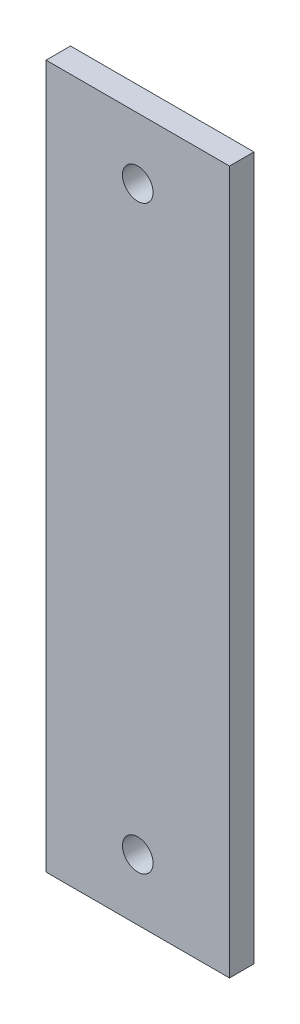
ISO-10303-21;
HEADER;
FILE_DESCRIPTION(('STEP AP214'),'2;1');
FILE_NAME('part.step','',(''),(''),'','','');
FILE_SCHEMA(('AUTOMOTIVE_DESIGN { 1 0 10303 214 1 1 1 1 }'));
ENDSEC;
DATA;
#1=APPLICATION_CONTEXT('core data for automotive mechanical design processes');
#2=APPLICATION_PROTOCOL_DEFINITION('international standard','automotive_design',2000,#1);
#3=PRODUCT_CONTEXT('',#1,'mechanical');
#4=PRODUCT('Part','Part','',(#3));
#5=PRODUCT_RELATED_PRODUCT_CATEGORY('part','',(#4));
#6=PRODUCT_DEFINITION_FORMATION('','',#4);
#7=PRODUCT_DEFINITION_CONTEXT('part definition',#1,'design');
#8=PRODUCT_DEFINITION('design','',#6,#7);
#9=PRODUCT_DEFINITION_SHAPE('','',#8);
#10=(LENGTH_UNIT() NAMED_UNIT(*) SI_UNIT(.MILLI.,.METRE.));
#11=(NAMED_UNIT(*) PLANE_ANGLE_UNIT() SI_UNIT($,.RADIAN.));
#12=(NAMED_UNIT(*) SI_UNIT($,.STERADIAN.) SOLID_ANGLE_UNIT());
#13=UNCERTAINTY_MEASURE_WITH_UNIT(LENGTH_MEASURE(1.E-05),#10,'distance_accuracy_value','');
#14=(GEOMETRIC_REPRESENTATION_CONTEXT(3) GLOBAL_UNCERTAINTY_ASSIGNED_CONTEXT((#13)) GLOBAL_UNIT_ASSIGNED_CONTEXT((#10,
#11,#12)) REPRESENTATION_CONTEXT('',''));
#15=CARTESIAN_POINT('',(0.,0.,0.));
#16=DIRECTION('',(0.,0.,1.));
#17=DIRECTION('',(1.,0.,0.));
#18=AXIS2_PLACEMENT_3D('',#15,#16,#17);
#19=CARTESIAN_POINT('',(0.,0.,4.));
#20=DIRECTION('',(0.,0.,1.));
#21=DIRECTION('',(1.,0.,0.));
#22=AXIS2_PLACEMENT_3D('',#19,#20,#21);
#23=PLANE('',#22);
#24=CARTESIAN_POINT('',(0.,47.5,4.));
#25=DIRECTION('',(0.,0.,1.));
#26=DIRECTION('',(1.,0.,0.));
#27=AXIS2_PLACEMENT_3D('',#24,#25,#26);
#28=CIRCLE('',#27,2.5);
#29=CARTESIAN_POINT('',(2.5,47.5,4.));
#30=VERTEX_POINT('',#29);
#31=EDGE_CURVE('E118',#30,#30,#28,.T.);
#32=ORIENTED_EDGE('',*,*,#31,.F.);
#33=EDGE_LOOP('',(#32));
#34=FACE_BOUND('',#33,.T.);
#35=DIRECTION('',(0.,1.,0.));
#36=VECTOR('',#35,1.);
#37=CARTESIAN_POINT('',(15.,57.5,4.));
#38=LINE('',#37,#36);
#39=CARTESIAN_POINT('',(15.,-57.5,4.));
#40=VERTEX_POINT('',#39);
#41=CARTESIAN_POINT('',(15.,57.5,4.));
#42=VERTEX_POINT('',#41);
#43=EDGE_CURVE('E98',#40,#42,#38,.T.);
#44=ORIENTED_EDGE('',*,*,#43,.T.);
#45=DIRECTION('',(-1.,0.,0.));
#46=VECTOR('',#45,1.);
#47=CARTESIAN_POINT('',(-15.,57.5,4.));
#48=LINE('',#47,#46);
#49=CARTESIAN_POINT('',(-15.,57.5,4.));
#50=VERTEX_POINT('',#49);
#51=EDGE_CURVE('E93',#42,#50,#48,.T.);
#52=ORIENTED_EDGE('',*,*,#51,.T.);
#53=DIRECTION('',(0.,-1.,0.));
#54=VECTOR('',#53,1.);
#55=CARTESIAN_POINT('',(-15.,57.5,4.));
#56=LINE('',#55,#54);
#57=CARTESIAN_POINT('',(-15.,-57.5,4.));
#58=VERTEX_POINT('',#57);
#59=EDGE_CURVE('E96',#50,#58,#56,.T.);
#60=ORIENTED_EDGE('',*,*,#59,.T.);
#61=DIRECTION('',(1.,0.,0.));
#62=VECTOR('',#61,1.);
#63=CARTESIAN_POINT('',(-15.,-57.5,4.));
#64=LINE('',#63,#62);
#65=EDGE_CURVE('E63',#58,#40,#64,.T.);
#66=ORIENTED_EDGE('',*,*,#65,.T.);
#67=EDGE_LOOP('',(#44,#52,#60,#66));
#68=FACE_BOUND('',#67,.T.);
#69=CARTESIAN_POINT('',(0.,-47.5,4.));
#70=DIRECTION('',(0.,0.,1.));
#71=DIRECTION('',(-1.,0.,0.));
#72=AXIS2_PLACEMENT_3D('',#69,#70,#71);
#73=CIRCLE('',#72,2.5);
#74=CARTESIAN_POINT('',(-2.5,-47.5,4.));
#75=VERTEX_POINT('',#74);
#76=EDGE_CURVE('E140',#75,#75,#73,.T.);
#77=ORIENTED_EDGE('',*,*,#76,.F.);
#78=EDGE_LOOP('',(#77));
#79=FACE_BOUND('',#78,.T.);
#80=ADVANCED_FACE('F45',(#34,#68,#79),#23,.T.);
#81=CARTESIAN_POINT('',(0.,0.,0.));
#82=DIRECTION('',(0.,0.,1.));
#83=DIRECTION('',(1.,0.,0.));
#84=AXIS2_PLACEMENT_3D('',#81,#82,#83);
#85=PLANE('',#84);
#86=DIRECTION('',(0.,1.,0.));
#87=VECTOR('',#86,1.);
#88=CARTESIAN_POINT('',(15.,57.5,0.));
#89=LINE('',#88,#87);
#90=CARTESIAN_POINT('',(15.,-57.5,0.));
#91=VERTEX_POINT('',#90);
#92=CARTESIAN_POINT('',(15.,57.5,0.));
#93=VERTEX_POINT('',#92);
#94=EDGE_CURVE('E114',#91,#93,#89,.T.);
#95=ORIENTED_EDGE('',*,*,#94,.F.);
#96=DIRECTION('',(1.,0.,0.));
#97=VECTOR('',#96,1.);
#98=CARTESIAN_POINT('',(-15.,-57.5,0.));
#99=LINE('',#98,#97);
#100=CARTESIAN_POINT('',(-15.,-57.5,0.));
#101=VERTEX_POINT('',#100);
#102=EDGE_CURVE('E86',#101,#91,#99,.T.);
#103=ORIENTED_EDGE('',*,*,#102,.F.);
#104=DIRECTION('',(0.,-1.,0.));
#105=VECTOR('',#104,1.);
#106=CARTESIAN_POINT('',(-15.,57.5,0.));
#107=LINE('',#106,#105);
#108=CARTESIAN_POINT('',(-15.,57.5,0.));
#109=VERTEX_POINT('',#108);
#110=EDGE_CURVE('E80',#109,#101,#107,.T.);
#111=ORIENTED_EDGE('',*,*,#110,.F.);
#112=DIRECTION('',(-1.,0.,0.));
#113=VECTOR('',#112,1.);
#114=CARTESIAN_POINT('',(-15.,57.5,0.));
#115=LINE('',#114,#113);
#116=EDGE_CURVE('E103',#93,#109,#115,.T.);
#117=ORIENTED_EDGE('',*,*,#116,.F.);
#118=EDGE_LOOP('',(#95,#103,#111,#117));
#119=FACE_BOUND('',#118,.T.);
#120=CARTESIAN_POINT('',(0.,47.5,0.));
#121=DIRECTION('',(0.,0.,1.));
#122=DIRECTION('',(1.,0.,0.));
#123=AXIS2_PLACEMENT_3D('',#120,#121,#122);
#124=CIRCLE('',#123,2.5);
#125=CARTESIAN_POINT('',(2.5,47.5,0.));
#126=VERTEX_POINT('',#125);
#127=EDGE_CURVE('E136',#126,#126,#124,.T.);
#128=ORIENTED_EDGE('',*,*,#127,.T.);
#129=EDGE_LOOP('',(#128));
#130=FACE_BOUND('',#129,.T.);
#131=CARTESIAN_POINT('',(0.,-47.5,0.));
#132=DIRECTION('',(0.,0.,1.));
#133=DIRECTION('',(-1.,0.,0.));
#134=AXIS2_PLACEMENT_3D('',#131,#132,#133);
#135=CIRCLE('',#134,2.5);
#136=CARTESIAN_POINT('',(-2.5,-47.5,0.));
#137=VERTEX_POINT('',#136);
#138=EDGE_CURVE('E144',#137,#137,#135,.T.);
#139=ORIENTED_EDGE('',*,*,#138,.T.);
#140=EDGE_LOOP('',(#139));
#141=FACE_BOUND('',#140,.T.);
#142=ADVANCED_FACE('F131',(#119,#130,#141),#85,.F.);
#143=CARTESIAN_POINT('',(15.,57.5,4.));
#144=DIRECTION('',(-1.,0.,0.));
#145=DIRECTION('',(0.,-1.,0.));
#146=AXIS2_PLACEMENT_3D('',#143,#144,#145);
#147=PLANE('',#146);
#148=ORIENTED_EDGE('',*,*,#94,.T.);
#149=DIRECTION('',(0.,0.,-1.));
#150=VECTOR('',#149,1.);
#151=CARTESIAN_POINT('',(15.,57.5,4.));
#152=LINE('',#151,#150);
#153=EDGE_CURVE('E11',#42,#93,#152,.T.);
#154=ORIENTED_EDGE('',*,*,#153,.F.);
#155=ORIENTED_EDGE('',*,*,#43,.F.);
#156=DIRECTION('',(0.,0.,-1.));
#157=VECTOR('',#156,1.);
#158=CARTESIAN_POINT('',(15.,-57.5,4.));
#159=LINE('',#158,#157);
#160=EDGE_CURVE('E110',#40,#91,#159,.T.);
#161=ORIENTED_EDGE('',*,*,#160,.T.);
#162=EDGE_LOOP('',(#148,#154,#155,#161));
#163=FACE_BOUND('',#162,.T.);
#164=ADVANCED_FACE('F47',(#163),#147,.F.);
#165=CARTESIAN_POINT('',(-15.,57.5,4.));
#166=DIRECTION('',(0.,-1.,0.));
#167=DIRECTION('',(0.,0.,-1.));
#168=AXIS2_PLACEMENT_3D('',#165,#166,#167);
#169=PLANE('',#168);
#170=ORIENTED_EDGE('',*,*,#116,.T.);
#171=DIRECTION('',(0.,0.,-1.));
#172=VECTOR('',#171,1.);
#173=CARTESIAN_POINT('',(-15.,57.5,4.));
#174=LINE('',#173,#172);
#175=EDGE_CURVE('E55',#50,#109,#174,.T.);
#176=ORIENTED_EDGE('',*,*,#175,.F.);
#177=ORIENTED_EDGE('',*,*,#51,.F.);
#178=ORIENTED_EDGE('',*,*,#153,.T.);
#179=EDGE_LOOP('',(#170,#176,#177,#178));
#180=FACE_BOUND('',#179,.T.);
#181=ADVANCED_FACE('F102',(#180),#169,.F.);
#182=CARTESIAN_POINT('',(-15.,57.5,4.));
#183=DIRECTION('',(1.,0.,0.));
#184=DIRECTION('',(0.,1.,0.));
#185=AXIS2_PLACEMENT_3D('',#182,#183,#184);
#186=PLANE('',#185);
#187=ORIENTED_EDGE('',*,*,#110,.T.);
#188=DIRECTION('',(0.,0.,-1.));
#189=VECTOR('',#188,1.);
#190=CARTESIAN_POINT('',(-15.,-57.5,4.));
#191=LINE('',#190,#189);
#192=EDGE_CURVE('E105',#58,#101,#191,.T.);
#193=ORIENTED_EDGE('',*,*,#192,.F.);
#194=ORIENTED_EDGE('',*,*,#59,.F.);
#195=ORIENTED_EDGE('',*,*,#175,.T.);
#196=EDGE_LOOP('',(#187,#193,#194,#195));
#197=FACE_BOUND('',#196,.T.);
#198=ADVANCED_FACE('F106',(#197),#186,.F.);
#199=CARTESIAN_POINT('',(-15.,-57.5,4.));
#200=DIRECTION('',(0.,1.,0.));
#201=DIRECTION('',(0.,0.,1.));
#202=AXIS2_PLACEMENT_3D('',#199,#200,#201);
#203=PLANE('',#202);
#204=ORIENTED_EDGE('',*,*,#102,.T.);
#205=ORIENTED_EDGE('',*,*,#160,.F.);
#206=ORIENTED_EDGE('',*,*,#65,.F.);
#207=ORIENTED_EDGE('',*,*,#192,.T.);
#208=EDGE_LOOP('',(#204,#205,#206,#207));
#209=FACE_BOUND('',#208,.T.);
#210=ADVANCED_FACE('F128',(#209),#203,.F.);
#211=CARTESIAN_POINT('',(0.,47.5,4.));
#212=DIRECTION('',(0.,0.,-1.));
#213=DIRECTION('',(-1.,0.,0.));
#214=AXIS2_PLACEMENT_3D('',#211,#212,#213);
#215=CYLINDRICAL_SURFACE('',#214,2.5);
#216=ORIENTED_EDGE('',*,*,#31,.T.);
#217=EDGE_LOOP('',(#216));
#218=FACE_BOUND('',#217,.T.);
#219=ORIENTED_EDGE('',*,*,#127,.F.);
#220=EDGE_LOOP('',(#219));
#221=FACE_BOUND('',#220,.T.);
#222=ADVANCED_FACE('F163',(#218,#221),#215,.F.);
#223=CARTESIAN_POINT('',(0.,-47.5,4.));
#224=DIRECTION('',(0.,0.,-1.));
#225=DIRECTION('',(-1.,0.,0.));
#226=AXIS2_PLACEMENT_3D('',#223,#224,#225);
#227=CYLINDRICAL_SURFACE('',#226,2.5);
#228=ORIENTED_EDGE('',*,*,#76,.T.);
#229=EDGE_LOOP('',(#228));
#230=FACE_BOUND('',#229,.T.);
#231=ORIENTED_EDGE('',*,*,#138,.F.);
#232=EDGE_LOOP('',(#231));
#233=FACE_BOUND('',#232,.T.);
#234=ADVANCED_FACE('F152',(#230,#233),#227,.F.);
#235=CLOSED_SHELL('',(#80,#142,#164,#181,#198,#210,#222,#234));
#236=MANIFOLD_SOLID_BREP('B2',#235);
#237=ADVANCED_BREP_SHAPE_REPRESENTATION('',(#18,#236),#14);
#238=SHAPE_DEFINITION_REPRESENTATION(#9,#237);
ENDSEC;
END-ISO-10303-21;
